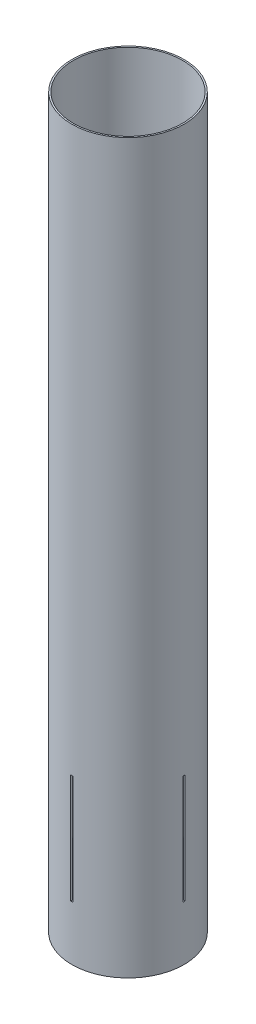
ISO-10303-21;
HEADER;
FILE_DESCRIPTION(('STEP AP214'),'2;1');
FILE_NAME('part.step','',(''),(''),'','','');
FILE_SCHEMA(('AUTOMOTIVE_DESIGN { 1 0 10303 214 1 1 1 1 }'));
ENDSEC;
DATA;
#1=APPLICATION_CONTEXT('core data for automotive mechanical design processes');
#2=APPLICATION_PROTOCOL_DEFINITION('international standard','automotive_design',2000,#1);
#3=PRODUCT_CONTEXT('',#1,'mechanical');
#4=PRODUCT('Part','Part','',(#3));
#5=PRODUCT_RELATED_PRODUCT_CATEGORY('part','',(#4));
#6=PRODUCT_DEFINITION_FORMATION('','',#4);
#7=PRODUCT_DEFINITION_CONTEXT('part definition',#1,'design');
#8=PRODUCT_DEFINITION('design','',#6,#7);
#9=PRODUCT_DEFINITION_SHAPE('','',#8);
#10=(LENGTH_UNIT() NAMED_UNIT(*) SI_UNIT(.MILLI.,.METRE.));
#11=(NAMED_UNIT(*) PLANE_ANGLE_UNIT() SI_UNIT($,.RADIAN.));
#12=(NAMED_UNIT(*) SI_UNIT($,.STERADIAN.) SOLID_ANGLE_UNIT());
#13=UNCERTAINTY_MEASURE_WITH_UNIT(LENGTH_MEASURE(1.E-05),#10,'distance_accuracy_value','');
#14=(GEOMETRIC_REPRESENTATION_CONTEXT(3) GLOBAL_UNCERTAINTY_ASSIGNED_CONTEXT((#13)) GLOBAL_UNIT_ASSIGNED_CONTEXT((#10,
#11,#12)) REPRESENTATION_CONTEXT('',''));
#15=CARTESIAN_POINT('',(0.,0.,0.));
#16=DIRECTION('',(0.,0.,1.));
#17=DIRECTION('',(1.,0.,0.));
#18=AXIS2_PLACEMENT_3D('',#15,#16,#17);
#19=CARTESIAN_POINT('',(0.,1016.,0.));
#20=DIRECTION('',(0.,-1.,0.));
#21=DIRECTION('',(0.,0.,-1.));
#22=AXIS2_PLACEMENT_3D('',#19,#20,#21);
#23=CYLINDRICAL_SURFACE('',#22,78.359);
#24=DIRECTION('',(0.,-1.,0.));
#25=VECTOR('',#24,1.);
#26=CARTESIAN_POINT('',(-78.3429175149228,1016.,-1.5875));
#27=LINE('',#26,#25);
#28=CARTESIAN_POINT('',(-78.3429175149228,76.2,-1.5875));
#29=VERTEX_POINT('',#28);
#30=CARTESIAN_POINT('',(-78.3429175149228,228.6,-1.5875));
#31=VERTEX_POINT('',#30);
#32=EDGE_CURVE('E224',#29,#31,#27,.F.);
#33=ORIENTED_EDGE('',*,*,#32,.T.);
#34=CARTESIAN_POINT('',(0.,228.6,0.));
#35=DIRECTION('',(0.,1.,0.));
#36=DIRECTION('',(0.,0.,1.));
#37=AXIS2_PLACEMENT_3D('',#34,#35,#36);
#38=CIRCLE('',#37,78.359);
#39=CARTESIAN_POINT('',(-78.3429175149228,228.6,1.5875));
#40=VERTEX_POINT('',#39);
#41=EDGE_CURVE('E227',#31,#40,#38,.T.);
#42=ORIENTED_EDGE('',*,*,#41,.T.);
#43=DIRECTION('',(0.,-1.,0.));
#44=VECTOR('',#43,1.);
#45=CARTESIAN_POINT('',(-78.3429175149228,1016.,1.5875));
#46=LINE('',#45,#44);
#47=CARTESIAN_POINT('',(-78.3429175149228,76.2,1.5875));
#48=VERTEX_POINT('',#47);
#49=EDGE_CURVE('E229',#48,#40,#46,.F.);
#50=ORIENTED_EDGE('',*,*,#49,.F.);
#51=CARTESIAN_POINT('',(0.,76.2,0.));
#52=DIRECTION('',(0.,1.,0.));
#53=DIRECTION('',(0.,0.,1.));
#54=AXIS2_PLACEMENT_3D('',#51,#52,#53);
#55=CIRCLE('',#54,78.359);
#56=EDGE_CURVE('E215',#29,#48,#55,.T.);
#57=ORIENTED_EDGE('',*,*,#56,.F.);
#58=EDGE_LOOP('',(#33,#42,#50,#57));
#59=FACE_BOUND('',#58,.T.);
#60=CARTESIAN_POINT('',(0.,1016.,0.));
#61=DIRECTION('',(0.,1.,0.));
#62=DIRECTION('',(0.,0.,1.));
#63=AXIS2_PLACEMENT_3D('',#60,#61,#62);
#64=CIRCLE('',#63,78.359);
#65=CARTESIAN_POINT('',(0.,1016.,78.359));
#66=VERTEX_POINT('',#65);
#67=EDGE_CURVE('E239',#66,#66,#64,.T.);
#68=ORIENTED_EDGE('',*,*,#67,.F.);
#69=EDGE_LOOP('',(#68));
#70=FACE_BOUND('',#69,.T.);
#71=CARTESIAN_POINT('',(0.,0.,0.));
#72=DIRECTION('',(0.,1.,0.));
#73=DIRECTION('',(0.,0.,1.));
#74=AXIS2_PLACEMENT_3D('',#71,#72,#73);
#75=CIRCLE('',#74,78.359);
#76=CARTESIAN_POINT('',(0.,0.,78.359));
#77=VERTEX_POINT('',#76);
#78=EDGE_CURVE('E236',#77,#77,#75,.T.);
#79=ORIENTED_EDGE('',*,*,#78,.T.);
#80=EDGE_LOOP('',(#79));
#81=FACE_BOUND('',#80,.T.);
#82=CARTESIAN_POINT('',(0.,228.6,0.));
#83=DIRECTION('',(0.,1.,0.));
#84=DIRECTION('',(0.,0.,1.));
#85=AXIS2_PLACEMENT_3D('',#82,#83,#84);
#86=CIRCLE('',#85,78.359);
#87=CARTESIAN_POINT('',(-1.58750000000027,228.6,78.3429175149228));
#88=VERTEX_POINT('',#87);
#89=CARTESIAN_POINT('',(1.58749999999918,228.6,78.3429175149228));
#90=VERTEX_POINT('',#89);
#91=EDGE_CURVE('E150',#88,#90,#86,.T.);
#92=ORIENTED_EDGE('',*,*,#91,.T.);
#93=DIRECTION('',(0.,-1.,0.));
#94=VECTOR('',#93,1.);
#95=CARTESIAN_POINT('',(1.58749999999918,1016.,78.3429175149228));
#96=LINE('',#95,#94);
#97=CARTESIAN_POINT('',(1.58749999999918,76.2,78.3429175149228));
#98=VERTEX_POINT('',#97);
#99=EDGE_CURVE('E152',#98,#90,#96,.F.);
#100=ORIENTED_EDGE('',*,*,#99,.F.);
#101=CARTESIAN_POINT('',(0.,76.2,0.));
#102=DIRECTION('',(0.,1.,0.));
#103=DIRECTION('',(0.,0.,1.));
#104=AXIS2_PLACEMENT_3D('',#101,#102,#103);
#105=CIRCLE('',#104,78.359);
#106=CARTESIAN_POINT('',(-1.58750000000027,76.2,78.3429175149228));
#107=VERTEX_POINT('',#106);
#108=EDGE_CURVE('E201',#107,#98,#105,.T.);
#109=ORIENTED_EDGE('',*,*,#108,.F.);
#110=DIRECTION('',(0.,-1.,0.));
#111=VECTOR('',#110,1.);
#112=CARTESIAN_POINT('',(-1.58750000000027,1016.,78.3429175149228));
#113=LINE('',#112,#111);
#114=EDGE_CURVE('E154',#88,#107,#113,.T.);
#115=ORIENTED_EDGE('',*,*,#114,.F.);
#116=EDGE_LOOP('',(#92,#100,#109,#115));
#117=FACE_BOUND('',#116,.T.);
#118=DIRECTION('',(0.,-1.,0.));
#119=VECTOR('',#118,1.);
#120=CARTESIAN_POINT('',(78.3429175149228,1016.,1.5875));
#121=LINE('',#120,#119);
#122=CARTESIAN_POINT('',(78.3429175149228,76.2,1.5875));
#123=VERTEX_POINT('',#122);
#124=CARTESIAN_POINT('',(78.3429175149228,228.6,1.5875));
#125=VERTEX_POINT('',#124);
#126=EDGE_CURVE('E198',#123,#125,#121,.F.);
#127=ORIENTED_EDGE('',*,*,#126,.T.);
#128=CARTESIAN_POINT('',(78.3429175149228,228.6,-1.5875));
#129=VERTEX_POINT('',#128);
#130=EDGE_CURVE('E161',#125,#129,#86,.T.);
#131=ORIENTED_EDGE('',*,*,#130,.T.);
#132=DIRECTION('',(0.,-1.,0.));
#133=VECTOR('',#132,1.);
#134=CARTESIAN_POINT('',(78.3429175149228,1016.,-1.5875));
#135=LINE('',#134,#133);
#136=CARTESIAN_POINT('',(78.3429175149228,76.2,-1.5875));
#137=VERTEX_POINT('',#136);
#138=EDGE_CURVE('E165',#137,#129,#135,.F.);
#139=ORIENTED_EDGE('',*,*,#138,.F.);
#140=EDGE_CURVE('E50',#123,#137,#105,.T.);
#141=ORIENTED_EDGE('',*,*,#140,.F.);
#142=EDGE_LOOP('',(#127,#131,#139,#141));
#143=FACE_BOUND('',#142,.T.);
#144=DIRECTION('',(0.,-1.,0.));
#145=VECTOR('',#144,1.);
#146=CARTESIAN_POINT('',(1.58750000000027,1016.,-78.3429175149228));
#147=LINE('',#146,#145);
#148=CARTESIAN_POINT('',(1.58750000000027,76.2,-78.3429175149228));
#149=VERTEX_POINT('',#148);
#150=CARTESIAN_POINT('',(1.58750000000027,228.6,-78.3429175149228));
#151=VERTEX_POINT('',#150);
#152=EDGE_CURVE('E208',#149,#151,#147,.F.);
#153=ORIENTED_EDGE('',*,*,#152,.T.);
#154=CARTESIAN_POINT('',(-1.58749999999973,228.6,-78.3429175149228));
#155=VERTEX_POINT('',#154);
#156=EDGE_CURVE('E159',#151,#155,#86,.T.);
#157=ORIENTED_EDGE('',*,*,#156,.T.);
#158=DIRECTION('',(0.,-1.,0.));
#159=VECTOR('',#158,1.);
#160=CARTESIAN_POINT('',(-1.58749999999973,1016.,-78.3429175149228));
#161=LINE('',#160,#159);
#162=CARTESIAN_POINT('',(-1.58749999999973,76.2,-78.3429175149228));
#163=VERTEX_POINT('',#162);
#164=EDGE_CURVE('E204',#163,#155,#161,.F.);
#165=ORIENTED_EDGE('',*,*,#164,.F.);
#166=EDGE_CURVE('E202',#149,#163,#105,.T.);
#167=ORIENTED_EDGE('',*,*,#166,.F.);
#168=EDGE_LOOP('',(#153,#157,#165,#167));
#169=FACE_BOUND('',#168,.T.);
#170=ADVANCED_FACE('F33',(#59,#70,#81,#117,#143,#169),#23,.T.);
#171=CARTESIAN_POINT('',(0.,1016.,0.));
#172=DIRECTION('',(0.,-1.,0.));
#173=DIRECTION('',(0.,0.,-1.));
#174=AXIS2_PLACEMENT_3D('',#171,#172,#173);
#175=CYLINDRICAL_SURFACE('',#174,76.2);
#176=CARTESIAN_POINT('',(0.,228.6,0.));
#177=DIRECTION('',(0.,1.,0.));
#178=DIRECTION('',(0.,0.,1.));
#179=AXIS2_PLACEMENT_3D('',#176,#177,#178);
#180=CIRCLE('',#179,76.2);
#181=CARTESIAN_POINT('',(1.58750000000027,228.6,-76.1834617469566));
#182=VERTEX_POINT('',#181);
#183=CARTESIAN_POINT('',(-1.58749999999973,228.6,-76.1834617469566));
#184=VERTEX_POINT('',#183);
#185=EDGE_CURVE('E11',#182,#184,#180,.T.);
#186=ORIENTED_EDGE('',*,*,#185,.F.);
#187=DIRECTION('',(0.,-1.,0.));
#188=VECTOR('',#187,1.);
#189=CARTESIAN_POINT('',(1.58750000000027,1016.,-76.1834617469566));
#190=LINE('',#189,#188);
#191=CARTESIAN_POINT('',(1.58750000000027,76.2,-76.1834617469566));
#192=VERTEX_POINT('',#191);
#193=EDGE_CURVE('E36',#192,#182,#190,.F.);
#194=ORIENTED_EDGE('',*,*,#193,.F.);
#195=CARTESIAN_POINT('',(0.,76.2,0.));
#196=DIRECTION('',(0.,1.,0.));
#197=DIRECTION('',(0.,0.,1.));
#198=AXIS2_PLACEMENT_3D('',#195,#196,#197);
#199=CIRCLE('',#198,76.2);
#200=CARTESIAN_POINT('',(-1.58749999999973,76.2,-76.1834617469566));
#201=VERTEX_POINT('',#200);
#202=EDGE_CURVE('E258',#192,#201,#199,.T.);
#203=ORIENTED_EDGE('',*,*,#202,.T.);
#204=DIRECTION('',(0.,-1.,0.));
#205=VECTOR('',#204,1.);
#206=CARTESIAN_POINT('',(-1.58749999999973,1016.,-76.1834617469566));
#207=LINE('',#206,#205);
#208=EDGE_CURVE('E268',#201,#184,#207,.F.);
#209=ORIENTED_EDGE('',*,*,#208,.T.);
#210=EDGE_LOOP('',(#186,#194,#203,#209));
#211=FACE_BOUND('',#210,.T.);
#212=DIRECTION('',(0.,-1.,0.));
#213=VECTOR('',#212,1.);
#214=CARTESIAN_POINT('',(76.1834617469566,1016.,1.5875));
#215=LINE('',#214,#213);
#216=CARTESIAN_POINT('',(76.1834617469566,76.2,1.5875));
#217=VERTEX_POINT('',#216);
#218=CARTESIAN_POINT('',(76.1834617469566,228.6,1.5875));
#219=VERTEX_POINT('',#218);
#220=EDGE_CURVE('E267',#217,#219,#215,.F.);
#221=ORIENTED_EDGE('',*,*,#220,.F.);
#222=CARTESIAN_POINT('',(76.1834617469566,76.2,-1.5875));
#223=VERTEX_POINT('',#222);
#224=EDGE_CURVE('E259',#217,#223,#199,.T.);
#225=ORIENTED_EDGE('',*,*,#224,.T.);
#226=DIRECTION('',(0.,-1.,0.));
#227=VECTOR('',#226,1.);
#228=CARTESIAN_POINT('',(76.1834617469566,1016.,-1.5875));
#229=LINE('',#228,#227);
#230=CARTESIAN_POINT('',(76.1834617469566,228.6,-1.5875));
#231=VERTEX_POINT('',#230);
#232=EDGE_CURVE('E264',#223,#231,#229,.F.);
#233=ORIENTED_EDGE('',*,*,#232,.T.);
#234=EDGE_CURVE('E42',#219,#231,#180,.T.);
#235=ORIENTED_EDGE('',*,*,#234,.F.);
#236=EDGE_LOOP('',(#221,#225,#233,#235));
#237=FACE_BOUND('',#236,.T.);
#238=CARTESIAN_POINT('',(0.,1016.,0.));
#239=DIRECTION('',(0.,1.,0.));
#240=DIRECTION('',(0.,0.,1.));
#241=AXIS2_PLACEMENT_3D('',#238,#239,#240);
#242=CIRCLE('',#241,76.2);
#243=CARTESIAN_POINT('',(0.,1016.,76.2));
#244=VERTEX_POINT('',#243);
#245=EDGE_CURVE('E233',#244,#244,#242,.T.);
#246=ORIENTED_EDGE('',*,*,#245,.T.);
#247=EDGE_LOOP('',(#246));
#248=FACE_BOUND('',#247,.T.);
#249=CARTESIAN_POINT('',(0.,0.,0.));
#250=DIRECTION('',(0.,1.,0.));
#251=DIRECTION('',(0.,0.,1.));
#252=AXIS2_PLACEMENT_3D('',#249,#250,#251);
#253=CIRCLE('',#252,76.2);
#254=CARTESIAN_POINT('',(0.,0.,76.2));
#255=VERTEX_POINT('',#254);
#256=EDGE_CURVE('E232',#255,#255,#253,.T.);
#257=ORIENTED_EDGE('',*,*,#256,.F.);
#258=EDGE_LOOP('',(#257));
#259=FACE_BOUND('',#258,.T.);
#260=CARTESIAN_POINT('',(0.,76.2,0.));
#261=DIRECTION('',(0.,1.,0.));
#262=DIRECTION('',(0.,0.,1.));
#263=AXIS2_PLACEMENT_3D('',#260,#261,#262);
#264=CIRCLE('',#263,76.2);
#265=CARTESIAN_POINT('',(-76.1834617469566,76.2,-1.5875));
#266=VERTEX_POINT('',#265);
#267=CARTESIAN_POINT('',(-76.1834617469566,76.2,1.5875));
#268=VERTEX_POINT('',#267);
#269=EDGE_CURVE('E242',#266,#268,#264,.T.);
#270=ORIENTED_EDGE('',*,*,#269,.T.);
#271=DIRECTION('',(0.,-1.,0.));
#272=VECTOR('',#271,1.);
#273=CARTESIAN_POINT('',(-76.1834617469566,1016.,1.5875));
#274=LINE('',#273,#272);
#275=CARTESIAN_POINT('',(-76.1834617469566,228.6,1.5875));
#276=VERTEX_POINT('',#275);
#277=EDGE_CURVE('E251',#268,#276,#274,.F.);
#278=ORIENTED_EDGE('',*,*,#277,.T.);
#279=CARTESIAN_POINT('',(0.,228.6,0.));
#280=DIRECTION('',(0.,1.,0.));
#281=DIRECTION('',(0.,0.,1.));
#282=AXIS2_PLACEMENT_3D('',#279,#280,#281);
#283=CIRCLE('',#282,76.2);
#284=CARTESIAN_POINT('',(-76.1834617469566,228.6,-1.5875));
#285=VERTEX_POINT('',#284);
#286=EDGE_CURVE('E249',#285,#276,#283,.T.);
#287=ORIENTED_EDGE('',*,*,#286,.F.);
#288=DIRECTION('',(0.,-1.,0.));
#289=VECTOR('',#288,1.);
#290=CARTESIAN_POINT('',(-76.1834617469566,1016.,-1.5875));
#291=LINE('',#290,#289);
#292=EDGE_CURVE('E247',#266,#285,#291,.F.);
#293=ORIENTED_EDGE('',*,*,#292,.F.);
#294=EDGE_LOOP('',(#270,#278,#287,#293));
#295=FACE_BOUND('',#294,.T.);
#296=CARTESIAN_POINT('',(-1.58750000000027,228.6,76.1834617469566));
#297=VERTEX_POINT('',#296);
#298=CARTESIAN_POINT('',(1.5874999999992,228.6,76.1834617469566));
#299=VERTEX_POINT('',#298);
#300=EDGE_CURVE('E43',#297,#299,#180,.T.);
#301=ORIENTED_EDGE('',*,*,#300,.F.);
#302=DIRECTION('',(0.,-1.,0.));
#303=VECTOR('',#302,1.);
#304=CARTESIAN_POINT('',(-1.58750000000027,1016.,76.1834617469566));
#305=LINE('',#304,#303);
#306=CARTESIAN_POINT('',(-1.58750000000027,76.2,76.1834617469566));
#307=VERTEX_POINT('',#306);
#308=EDGE_CURVE('E261',#297,#307,#305,.T.);
#309=ORIENTED_EDGE('',*,*,#308,.T.);
#310=CARTESIAN_POINT('',(1.5874999999992,76.2,76.1834617469566));
#311=VERTEX_POINT('',#310);
#312=EDGE_CURVE('E256',#307,#311,#199,.T.);
#313=ORIENTED_EDGE('',*,*,#312,.T.);
#314=DIRECTION('',(0.,-1.,0.));
#315=VECTOR('',#314,1.);
#316=CARTESIAN_POINT('',(1.5874999999992,1016.,76.1834617469566));
#317=LINE('',#316,#315);
#318=EDGE_CURVE('E254',#311,#299,#317,.F.);
#319=ORIENTED_EDGE('',*,*,#318,.T.);
#320=EDGE_LOOP('',(#301,#309,#313,#319));
#321=FACE_BOUND('',#320,.T.);
#322=ADVANCED_FACE('F284',(#211,#237,#248,#259,#295,#321),#175,.F.);
#323=CARTESIAN_POINT('',(0.,1016.,0.));
#324=DIRECTION('',(0.,1.,0.));
#325=DIRECTION('',(0.,0.,1.));
#326=AXIS2_PLACEMENT_3D('',#323,#324,#325);
#327=PLANE('',#326);
#328=ORIENTED_EDGE('',*,*,#67,.T.);
#329=EDGE_LOOP('',(#328));
#330=FACE_BOUND('',#329,.T.);
#331=ORIENTED_EDGE('',*,*,#245,.F.);
#332=EDGE_LOOP('',(#331));
#333=FACE_BOUND('',#332,.T.);
#334=ADVANCED_FACE('F315',(#330,#333),#327,.T.);
#335=CARTESIAN_POINT('',(0.,0.,0.));
#336=DIRECTION('',(0.,1.,0.));
#337=DIRECTION('',(0.,0.,1.));
#338=AXIS2_PLACEMENT_3D('',#335,#336,#337);
#339=PLANE('',#338);
#340=ORIENTED_EDGE('',*,*,#78,.F.);
#341=EDGE_LOOP('',(#340));
#342=FACE_BOUND('',#341,.T.);
#343=ORIENTED_EDGE('',*,*,#256,.T.);
#344=EDGE_LOOP('',(#343));
#345=FACE_BOUND('',#344,.T.);
#346=ADVANCED_FACE('F322',(#342,#345),#339,.F.);
#347=CARTESIAN_POINT('',(-78.359,0.,1.5875));
#348=DIRECTION('',(0.,0.,-1.));
#349=DIRECTION('',(-1.,0.,0.));
#350=AXIS2_PLACEMENT_3D('',#347,#348,#349);
#351=PLANE('',#350);
#352=ORIENTED_EDGE('',*,*,#49,.T.);
#353=DIRECTION('',(1.,0.,0.));
#354=VECTOR('',#353,1.);
#355=CARTESIAN_POINT('',(-78.359,228.6,1.5875));
#356=LINE('',#355,#354);
#357=EDGE_CURVE('E212',#40,#276,#356,.T.);
#358=ORIENTED_EDGE('',*,*,#357,.T.);
#359=ORIENTED_EDGE('',*,*,#277,.F.);
#360=DIRECTION('',(1.,0.,0.));
#361=VECTOR('',#360,1.);
#362=CARTESIAN_POINT('',(-78.359,76.2,1.5875));
#363=LINE('',#362,#361);
#364=EDGE_CURVE('E211',#48,#268,#363,.T.);
#365=ORIENTED_EDGE('',*,*,#364,.F.);
#366=EDGE_LOOP('',(#352,#358,#359,#365));
#367=FACE_BOUND('',#366,.T.);
#368=ADVANCED_FACE('F327',(#367),#351,.T.);
#369=CARTESIAN_POINT('',(-78.359,228.6,0.));
#370=DIRECTION('',(0.,1.,0.));
#371=DIRECTION('',(0.,0.,1.));
#372=AXIS2_PLACEMENT_3D('',#369,#370,#371);
#373=PLANE('',#372);
#374=DIRECTION('',(1.,0.,0.));
#375=VECTOR('',#374,1.);
#376=CARTESIAN_POINT('',(-78.359,228.6,-1.5875));
#377=LINE('',#376,#375);
#378=EDGE_CURVE('E216',#31,#285,#377,.T.);
#379=ORIENTED_EDGE('',*,*,#378,.T.);
#380=ORIENTED_EDGE('',*,*,#286,.T.);
#381=ORIENTED_EDGE('',*,*,#357,.F.);
#382=ORIENTED_EDGE('',*,*,#41,.F.);
#383=EDGE_LOOP('',(#379,#380,#381,#382));
#384=FACE_BOUND('',#383,.T.);
#385=ADVANCED_FACE('F334',(#384),#373,.F.);
#386=CARTESIAN_POINT('',(-78.359,0.,-1.5875));
#387=DIRECTION('',(0.,0.,-1.));
#388=DIRECTION('',(-1.,0.,0.));
#389=AXIS2_PLACEMENT_3D('',#386,#387,#388);
#390=PLANE('',#389);
#391=DIRECTION('',(1.,0.,0.));
#392=VECTOR('',#391,1.);
#393=CARTESIAN_POINT('',(-78.359,76.2,-1.5875));
#394=LINE('',#393,#392);
#395=EDGE_CURVE('E219',#29,#266,#394,.T.);
#396=ORIENTED_EDGE('',*,*,#395,.T.);
#397=ORIENTED_EDGE('',*,*,#292,.T.);
#398=ORIENTED_EDGE('',*,*,#378,.F.);
#399=ORIENTED_EDGE('',*,*,#32,.F.);
#400=EDGE_LOOP('',(#396,#397,#398,#399));
#401=FACE_BOUND('',#400,.T.);
#402=ADVANCED_FACE('F350',(#401),#390,.F.);
#403=CARTESIAN_POINT('',(-78.359,76.2,0.));
#404=DIRECTION('',(0.,1.,0.));
#405=DIRECTION('',(0.,0.,1.));
#406=AXIS2_PLACEMENT_3D('',#403,#404,#405);
#407=PLANE('',#406);
#408=ORIENTED_EDGE('',*,*,#56,.T.);
#409=ORIENTED_EDGE('',*,*,#364,.T.);
#410=ORIENTED_EDGE('',*,*,#269,.F.);
#411=ORIENTED_EDGE('',*,*,#395,.F.);
#412=EDGE_LOOP('',(#408,#409,#410,#411));
#413=FACE_BOUND('',#412,.T.);
#414=ADVANCED_FACE('F346',(#413),#407,.T.);
#415=CARTESIAN_POINT('',(1.58749999999918,0.,78.3590000000008));
#416=DIRECTION('',(-1.,0.,0.));
#417=DIRECTION('',(0.,0.,1.));
#418=AXIS2_PLACEMENT_3D('',#415,#416,#417);
#419=PLANE('',#418);
#420=ORIENTED_EDGE('',*,*,#99,.T.);
#421=DIRECTION('',(0.,0.,-1.));
#422=VECTOR('',#421,1.);
#423=CARTESIAN_POINT('',(1.58749999999918,228.6,78.3590000000008));
#424=LINE('',#423,#422);
#425=EDGE_CURVE('E163',#90,#299,#424,.T.);
#426=ORIENTED_EDGE('',*,*,#425,.T.);
#427=ORIENTED_EDGE('',*,*,#318,.F.);
#428=DIRECTION('',(0.,0.,-1.));
#429=VECTOR('',#428,1.);
#430=CARTESIAN_POINT('',(1.58749999999918,76.2,78.3590000000008));
#431=LINE('',#430,#429);
#432=EDGE_CURVE('E58',#98,#311,#431,.T.);
#433=ORIENTED_EDGE('',*,*,#432,.F.);
#434=EDGE_LOOP('',(#420,#426,#427,#433));
#435=FACE_BOUND('',#434,.T.);
#436=ADVANCED_FACE('F162',(#435),#419,.T.);
#437=CARTESIAN_POINT('',(2.7358898623041E-13,76.2,-78.3590000000002));
#438=DIRECTION('',(0.,1.,0.));
#439=DIRECTION('',(0.,0.,1.));
#440=AXIS2_PLACEMENT_3D('',#437,#438,#439);
#441=PLANE('',#440);
#442=ORIENTED_EDGE('',*,*,#108,.T.);
#443=ORIENTED_EDGE('',*,*,#432,.T.);
#444=ORIENTED_EDGE('',*,*,#312,.F.);
#445=DIRECTION('',(0.,0.,1.));
#446=VECTOR('',#445,1.);
#447=CARTESIAN_POINT('',(-1.58749999999973,76.2,-78.3590000000002));
#448=LINE('',#447,#446);
#449=EDGE_CURVE('E179',#307,#107,#448,.T.);
#450=ORIENTED_EDGE('',*,*,#449,.T.);
#451=EDGE_LOOP('',(#442,#443,#444,#450));
#452=FACE_BOUND('',#451,.T.);
#453=ADVANCED_FACE('F309',(#452),#441,.T.);
#454=CARTESIAN_POINT('',(2.7358898623041E-13,228.6,-78.3590000000002));
#455=DIRECTION('',(0.,1.,0.));
#456=DIRECTION('',(0.,0.,1.));
#457=AXIS2_PLACEMENT_3D('',#454,#455,#456);
#458=PLANE('',#457);
#459=ORIENTED_EDGE('',*,*,#91,.F.);
#460=DIRECTION('',(0.,0.,1.));
#461=VECTOR('',#460,1.);
#462=CARTESIAN_POINT('',(-1.58749999999973,228.6,-78.3590000000002));
#463=LINE('',#462,#461);
#464=EDGE_CURVE('E185',#297,#88,#463,.T.);
#465=ORIENTED_EDGE('',*,*,#464,.F.);
#466=ORIENTED_EDGE('',*,*,#300,.T.);
#467=ORIENTED_EDGE('',*,*,#425,.F.);
#468=EDGE_LOOP('',(#459,#465,#466,#467));
#469=FACE_BOUND('',#468,.T.);
#470=ADVANCED_FACE('F168',(#469),#458,.F.);
#471=CARTESIAN_POINT('',(-1.58749999999973,0.,-78.3590000000002));
#472=DIRECTION('',(1.,0.,0.));
#473=DIRECTION('',(0.,0.,-1.));
#474=AXIS2_PLACEMENT_3D('',#471,#472,#473);
#475=PLANE('',#474);
#476=ORIENTED_EDGE('',*,*,#114,.T.);
#477=ORIENTED_EDGE('',*,*,#449,.F.);
#478=ORIENTED_EDGE('',*,*,#308,.F.);
#479=ORIENTED_EDGE('',*,*,#464,.T.);
#480=EDGE_LOOP('',(#476,#477,#478,#479));
#481=FACE_BOUND('',#480,.T.);
#482=ADVANCED_FACE('F312',(#481),#475,.T.);
#483=CARTESIAN_POINT('',(78.359,0.,-1.5875));
#484=DIRECTION('',(0.,0.,1.));
#485=DIRECTION('',(1.,0.,0.));
#486=AXIS2_PLACEMENT_3D('',#483,#484,#485);
#487=PLANE('',#486);
#488=ORIENTED_EDGE('',*,*,#138,.T.);
#489=DIRECTION('',(-1.,0.,0.));
#490=VECTOR('',#489,1.);
#491=CARTESIAN_POINT('',(78.359,228.6,-1.5875));
#492=LINE('',#491,#490);
#493=EDGE_CURVE('E177',#129,#231,#492,.T.);
#494=ORIENTED_EDGE('',*,*,#493,.T.);
#495=ORIENTED_EDGE('',*,*,#232,.F.);
#496=DIRECTION('',(-1.,0.,0.));
#497=VECTOR('',#496,1.);
#498=CARTESIAN_POINT('',(78.359,76.2,-1.5875));
#499=LINE('',#498,#497);
#500=EDGE_CURVE('E171',#137,#223,#499,.T.);
#501=ORIENTED_EDGE('',*,*,#500,.F.);
#502=EDGE_LOOP('',(#488,#494,#495,#501));
#503=FACE_BOUND('',#502,.T.);
#504=ADVANCED_FACE('F287',(#503),#487,.T.);
#505=CARTESIAN_POINT('',(78.359,0.,1.5875));
#506=DIRECTION('',(0.,0.,1.));
#507=DIRECTION('',(1.,0.,0.));
#508=AXIS2_PLACEMENT_3D('',#505,#506,#507);
#509=PLANE('',#508);
#510=DIRECTION('',(-1.,0.,0.));
#511=VECTOR('',#510,1.);
#512=CARTESIAN_POINT('',(78.359,76.2,1.5875));
#513=LINE('',#512,#511);
#514=EDGE_CURVE('E173',#123,#217,#513,.T.);
#515=ORIENTED_EDGE('',*,*,#514,.T.);
#516=ORIENTED_EDGE('',*,*,#220,.T.);
#517=DIRECTION('',(-1.,0.,0.));
#518=VECTOR('',#517,1.);
#519=CARTESIAN_POINT('',(78.359,228.6,1.5875));
#520=LINE('',#519,#518);
#521=EDGE_CURVE('E180',#125,#219,#520,.T.);
#522=ORIENTED_EDGE('',*,*,#521,.F.);
#523=ORIENTED_EDGE('',*,*,#126,.F.);
#524=EDGE_LOOP('',(#515,#516,#522,#523));
#525=FACE_BOUND('',#524,.T.);
#526=ADVANCED_FACE('F291',(#525),#509,.F.);
#527=ORIENTED_EDGE('',*,*,#140,.T.);
#528=ORIENTED_EDGE('',*,*,#500,.T.);
#529=ORIENTED_EDGE('',*,*,#224,.F.);
#530=ORIENTED_EDGE('',*,*,#514,.F.);
#531=EDGE_LOOP('',(#527,#528,#529,#530));
#532=FACE_BOUND('',#531,.T.);
#533=ADVANCED_FACE('F289',(#532),#441,.T.);
#534=ORIENTED_EDGE('',*,*,#521,.T.);
#535=ORIENTED_EDGE('',*,*,#234,.T.);
#536=ORIENTED_EDGE('',*,*,#493,.F.);
#537=ORIENTED_EDGE('',*,*,#130,.F.);
#538=EDGE_LOOP('',(#534,#535,#536,#537));
#539=FACE_BOUND('',#538,.T.);
#540=ADVANCED_FACE('F282',(#539),#458,.F.);
#541=CARTESIAN_POINT('',(1.58750000000027,0.,-78.3590000000002));
#542=DIRECTION('',(1.,0.,0.));
#543=DIRECTION('',(0.,0.,-1.));
#544=AXIS2_PLACEMENT_3D('',#541,#542,#543);
#545=PLANE('',#544);
#546=DIRECTION('',(0.,0.,1.));
#547=VECTOR('',#546,1.);
#548=CARTESIAN_POINT('',(1.58750000000027,76.2,-78.3590000000002));
#549=LINE('',#548,#547);
#550=EDGE_CURVE('E190',#149,#192,#549,.T.);
#551=ORIENTED_EDGE('',*,*,#550,.T.);
#552=ORIENTED_EDGE('',*,*,#193,.T.);
#553=DIRECTION('',(0.,0.,1.));
#554=VECTOR('',#553,1.);
#555=CARTESIAN_POINT('',(1.58750000000027,228.6,-78.3590000000002));
#556=LINE('',#555,#554);
#557=EDGE_CURVE('E187',#151,#182,#556,.T.);
#558=ORIENTED_EDGE('',*,*,#557,.F.);
#559=ORIENTED_EDGE('',*,*,#152,.F.);
#560=EDGE_LOOP('',(#551,#552,#558,#559));
#561=FACE_BOUND('',#560,.T.);
#562=ADVANCED_FACE('F304',(#561),#545,.F.);
#563=ORIENTED_EDGE('',*,*,#164,.T.);
#564=EDGE_CURVE('E166',#155,#184,#463,.T.);
#565=ORIENTED_EDGE('',*,*,#564,.T.);
#566=ORIENTED_EDGE('',*,*,#208,.F.);
#567=EDGE_CURVE('E193',#163,#201,#448,.T.);
#568=ORIENTED_EDGE('',*,*,#567,.F.);
#569=EDGE_LOOP('',(#563,#565,#566,#568));
#570=FACE_BOUND('',#569,.T.);
#571=ADVANCED_FACE('F301',(#570),#475,.T.);
#572=ORIENTED_EDGE('',*,*,#557,.T.);
#573=ORIENTED_EDGE('',*,*,#185,.T.);
#574=ORIENTED_EDGE('',*,*,#564,.F.);
#575=ORIENTED_EDGE('',*,*,#156,.F.);
#576=EDGE_LOOP('',(#572,#573,#574,#575));
#577=FACE_BOUND('',#576,.T.);
#578=ADVANCED_FACE('F302',(#577),#458,.F.);
#579=ORIENTED_EDGE('',*,*,#166,.T.);
#580=ORIENTED_EDGE('',*,*,#567,.T.);
#581=ORIENTED_EDGE('',*,*,#202,.F.);
#582=ORIENTED_EDGE('',*,*,#550,.F.);
#583=EDGE_LOOP('',(#579,#580,#581,#582));
#584=FACE_BOUND('',#583,.T.);
#585=ADVANCED_FACE('F307',(#584),#441,.T.);
#586=CLOSED_SHELL('',(#170,#322,#334,#346,#368,#385,#402,#414,#436,#453,#470,#482,#504,#526,
#533,#540,#562,#571,#578,#585));
#587=MANIFOLD_SOLID_BREP('B2',#586);
#588=ADVANCED_BREP_SHAPE_REPRESENTATION('',(#18,#587),#14);
#589=SHAPE_DEFINITION_REPRESENTATION(#9,#588);
ENDSEC;
END-ISO-10303-21;
